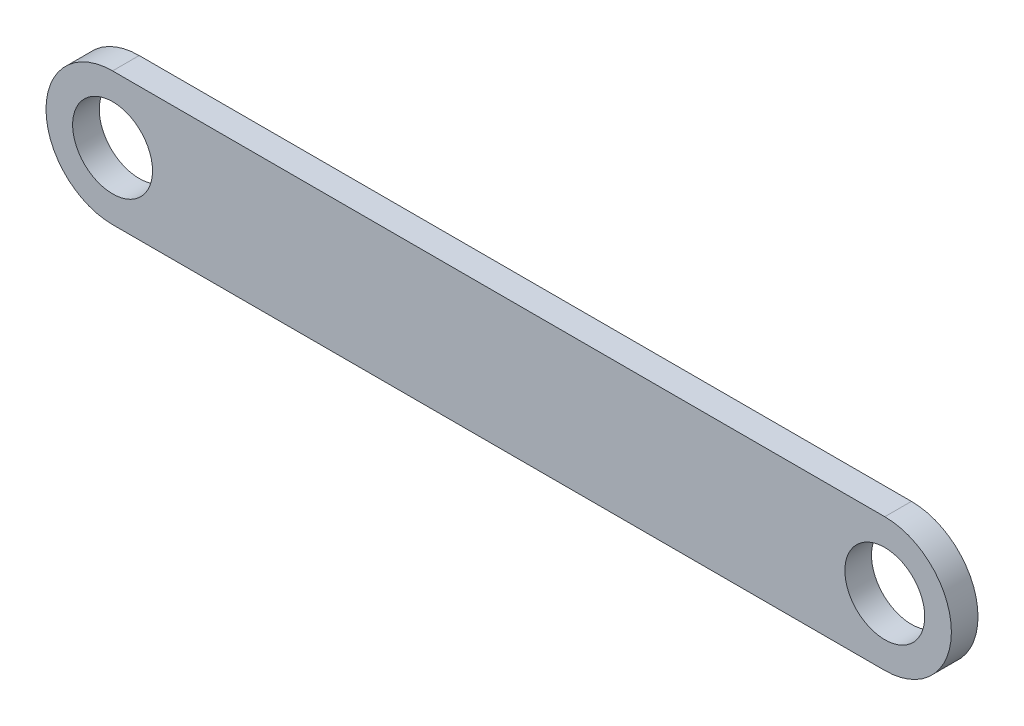
ISO-10303-21;
HEADER;
FILE_DESCRIPTION(('STEP AP214'),'2;1');
FILE_NAME('part.step','',(''),(''),'','','');
FILE_SCHEMA(('AUTOMOTIVE_DESIGN { 1 0 10303 214 1 1 1 1 }'));
ENDSEC;
DATA;
#1=APPLICATION_CONTEXT('core data for automotive mechanical design processes');
#2=APPLICATION_PROTOCOL_DEFINITION('international standard','automotive_design',2000,#1);
#3=PRODUCT_CONTEXT('',#1,'mechanical');
#4=PRODUCT('Part','Part','',(#3));
#5=PRODUCT_RELATED_PRODUCT_CATEGORY('part','',(#4));
#6=PRODUCT_DEFINITION_FORMATION('','',#4);
#7=PRODUCT_DEFINITION_CONTEXT('part definition',#1,'design');
#8=PRODUCT_DEFINITION('design','',#6,#7);
#9=PRODUCT_DEFINITION_SHAPE('','',#8);
#10=(LENGTH_UNIT() NAMED_UNIT(*) SI_UNIT(.MILLI.,.METRE.));
#11=(NAMED_UNIT(*) PLANE_ANGLE_UNIT() SI_UNIT($,.RADIAN.));
#12=(NAMED_UNIT(*) SI_UNIT($,.STERADIAN.) SOLID_ANGLE_UNIT());
#13=UNCERTAINTY_MEASURE_WITH_UNIT(LENGTH_MEASURE(1.E-05),#10,'distance_accuracy_value','');
#14=(GEOMETRIC_REPRESENTATION_CONTEXT(3) GLOBAL_UNCERTAINTY_ASSIGNED_CONTEXT((#13)) GLOBAL_UNIT_ASSIGNED_CONTEXT((#10,
#11,#12)) REPRESENTATION_CONTEXT('',''));
#15=CARTESIAN_POINT('',(0.,0.,0.));
#16=DIRECTION('',(0.,0.,1.));
#17=DIRECTION('',(1.,0.,0.));
#18=AXIS2_PLACEMENT_3D('',#15,#16,#17);
#19=CARTESIAN_POINT('',(0.,0.,2.5));
#20=DIRECTION('',(0.,0.,1.));
#21=DIRECTION('',(1.,0.,0.));
#22=AXIS2_PLACEMENT_3D('',#19,#20,#21);
#23=PLANE('',#22);
#24=CARTESIAN_POINT('',(0.,0.,2.5));
#25=DIRECTION('',(0.,0.,1.));
#26=DIRECTION('',(1.,0.,0.));
#27=AXIS2_PLACEMENT_3D('',#24,#25,#26);
#28=CIRCLE('',#27,7.5);
#29=CARTESIAN_POINT('',(7.5,0.,2.5));
#30=VERTEX_POINT('',#29);
#31=EDGE_CURVE('E102',#30,#30,#28,.T.);
#32=ORIENTED_EDGE('',*,*,#31,.F.);
#33=EDGE_LOOP('',(#32));
#34=FACE_BOUND('',#33,.T.);
#35=CARTESIAN_POINT('',(0.,0.,2.5));
#36=DIRECTION('',(0.,0.,1.));
#37=DIRECTION('',(1.,0.,0.));
#38=AXIS2_PLACEMENT_3D('',#35,#36,#37);
#39=CIRCLE('',#38,12.5);
#40=CARTESIAN_POINT('',(0.,12.5,2.5));
#41=VERTEX_POINT('',#40);
#42=CARTESIAN_POINT('',(0.,-12.5,2.5));
#43=VERTEX_POINT('',#42);
#44=EDGE_CURVE('E87',#41,#43,#39,.T.);
#45=ORIENTED_EDGE('',*,*,#44,.T.);
#46=DIRECTION('',(1.,0.,0.));
#47=VECTOR('',#46,1.);
#48=CARTESIAN_POINT('',(0.,-12.5,2.5));
#49=LINE('',#48,#47);
#50=CARTESIAN_POINT('',(145.,-12.5,2.5));
#51=VERTEX_POINT('',#50);
#52=EDGE_CURVE('E82',#43,#51,#49,.T.);
#53=ORIENTED_EDGE('',*,*,#52,.T.);
#54=CARTESIAN_POINT('',(145.,0.,2.5));
#55=DIRECTION('',(0.,0.,1.));
#56=DIRECTION('',(1.,0.,0.));
#57=AXIS2_PLACEMENT_3D('',#54,#55,#56);
#58=CIRCLE('',#57,12.5);
#59=CARTESIAN_POINT('',(145.,12.5,2.5));
#60=VERTEX_POINT('',#59);
#61=EDGE_CURVE('E85',#51,#60,#58,.T.);
#62=ORIENTED_EDGE('',*,*,#61,.T.);
#63=DIRECTION('',(-1.,0.,0.));
#64=VECTOR('',#63,1.);
#65=CARTESIAN_POINT('',(0.,12.5,2.5));
#66=LINE('',#65,#64);
#67=EDGE_CURVE('E52',#60,#41,#66,.T.);
#68=ORIENTED_EDGE('',*,*,#67,.T.);
#69=EDGE_LOOP('',(#45,#53,#62,#68));
#70=FACE_BOUND('',#69,.T.);
#71=CARTESIAN_POINT('',(145.,0.,2.5));
#72=DIRECTION('',(0.,0.,1.));
#73=DIRECTION('',(1.,0.,0.));
#74=AXIS2_PLACEMENT_3D('',#71,#72,#73);
#75=CIRCLE('',#74,7.50000000000001);
#76=CARTESIAN_POINT('',(152.5,0.,2.5));
#77=VERTEX_POINT('',#76);
#78=EDGE_CURVE('E117',#77,#77,#75,.T.);
#79=ORIENTED_EDGE('',*,*,#78,.F.);
#80=EDGE_LOOP('',(#79));
#81=FACE_BOUND('',#80,.T.);
#82=ADVANCED_FACE('F35',(#34,#70,#81),#23,.T.);
#83=CARTESIAN_POINT('',(0.,0.,-2.5));
#84=DIRECTION('',(0.,0.,1.));
#85=DIRECTION('',(1.,0.,0.));
#86=AXIS2_PLACEMENT_3D('',#83,#84,#85);
#87=PLANE('',#86);
#88=CARTESIAN_POINT('',(0.,0.,-2.5));
#89=DIRECTION('',(0.,0.,1.));
#90=DIRECTION('',(1.,0.,0.));
#91=AXIS2_PLACEMENT_3D('',#88,#89,#90);
#92=CIRCLE('',#91,12.5);
#93=CARTESIAN_POINT('',(0.,12.5,-2.5));
#94=VERTEX_POINT('',#93);
#95=CARTESIAN_POINT('',(0.,-12.5,-2.5));
#96=VERTEX_POINT('',#95);
#97=EDGE_CURVE('E99',#94,#96,#92,.T.);
#98=ORIENTED_EDGE('',*,*,#97,.F.);
#99=DIRECTION('',(-1.,0.,0.));
#100=VECTOR('',#99,1.);
#101=CARTESIAN_POINT('',(0.,12.5,-2.5));
#102=LINE('',#101,#100);
#103=CARTESIAN_POINT('',(145.,12.5,-2.5));
#104=VERTEX_POINT('',#103);
#105=EDGE_CURVE('E75',#104,#94,#102,.T.);
#106=ORIENTED_EDGE('',*,*,#105,.F.);
#107=CARTESIAN_POINT('',(145.,0.,-2.5));
#108=DIRECTION('',(0.,0.,1.));
#109=DIRECTION('',(1.,0.,0.));
#110=AXIS2_PLACEMENT_3D('',#107,#108,#109);
#111=CIRCLE('',#110,12.5);
#112=CARTESIAN_POINT('',(145.,-12.5,-2.5));
#113=VERTEX_POINT('',#112);
#114=EDGE_CURVE('E69',#113,#104,#111,.T.);
#115=ORIENTED_EDGE('',*,*,#114,.F.);
#116=DIRECTION('',(1.,0.,0.));
#117=VECTOR('',#116,1.);
#118=CARTESIAN_POINT('',(0.,-12.5,-2.5));
#119=LINE('',#118,#117);
#120=EDGE_CURVE('E91',#96,#113,#119,.T.);
#121=ORIENTED_EDGE('',*,*,#120,.F.);
#122=EDGE_LOOP('',(#98,#106,#115,#121));
#123=FACE_BOUND('',#122,.T.);
#124=CARTESIAN_POINT('',(0.,0.,-2.5));
#125=DIRECTION('',(0.,0.,1.));
#126=DIRECTION('',(1.,0.,0.));
#127=AXIS2_PLACEMENT_3D('',#124,#125,#126);
#128=CIRCLE('',#127,7.5);
#129=CARTESIAN_POINT('',(7.5,0.,-2.5));
#130=VERTEX_POINT('',#129);
#131=EDGE_CURVE('E114',#130,#130,#128,.T.);
#132=ORIENTED_EDGE('',*,*,#131,.T.);
#133=EDGE_LOOP('',(#132));
#134=FACE_BOUND('',#133,.T.);
#135=CARTESIAN_POINT('',(145.,0.,-2.5));
#136=DIRECTION('',(0.,0.,1.));
#137=DIRECTION('',(1.,0.,0.));
#138=AXIS2_PLACEMENT_3D('',#135,#136,#137);
#139=CIRCLE('',#138,7.50000000000001);
#140=CARTESIAN_POINT('',(152.5,0.,-2.5));
#141=VERTEX_POINT('',#140);
#142=EDGE_CURVE('E120',#141,#141,#139,.T.);
#143=ORIENTED_EDGE('',*,*,#142,.T.);
#144=EDGE_LOOP('',(#143));
#145=FACE_BOUND('',#144,.T.);
#146=ADVANCED_FACE('F110',(#123,#134,#145),#87,.F.);
#147=CARTESIAN_POINT('',(0.,0.,2.5));
#148=DIRECTION('',(0.,0.,-1.));
#149=DIRECTION('',(-1.,0.,0.));
#150=AXIS2_PLACEMENT_3D('',#147,#148,#149);
#151=CYLINDRICAL_SURFACE('',#150,12.5);
#152=ORIENTED_EDGE('',*,*,#97,.T.);
#153=DIRECTION('',(0.,0.,-1.));
#154=VECTOR('',#153,1.);
#155=CARTESIAN_POINT('',(0.,-12.5,2.5));
#156=LINE('',#155,#154);
#157=EDGE_CURVE('E11',#43,#96,#156,.T.);
#158=ORIENTED_EDGE('',*,*,#157,.F.);
#159=ORIENTED_EDGE('',*,*,#44,.F.);
#160=DIRECTION('',(0.,0.,-1.));
#161=VECTOR('',#160,1.);
#162=CARTESIAN_POINT('',(0.,12.5,2.5));
#163=LINE('',#162,#161);
#164=EDGE_CURVE('E95',#41,#94,#163,.T.);
#165=ORIENTED_EDGE('',*,*,#164,.T.);
#166=EDGE_LOOP('',(#152,#158,#159,#165));
#167=FACE_BOUND('',#166,.T.);
#168=ADVANCED_FACE('F37',(#167),#151,.T.);
#169=CARTESIAN_POINT('',(0.,-12.5,2.5));
#170=DIRECTION('',(0.,1.,0.));
#171=DIRECTION('',(-1.,0.,0.));
#172=AXIS2_PLACEMENT_3D('',#169,#170,#171);
#173=PLANE('',#172);
#174=ORIENTED_EDGE('',*,*,#120,.T.);
#175=DIRECTION('',(0.,0.,-1.));
#176=VECTOR('',#175,1.);
#177=CARTESIAN_POINT('',(145.,-12.5,2.5));
#178=LINE('',#177,#176);
#179=EDGE_CURVE('E44',#51,#113,#178,.T.);
#180=ORIENTED_EDGE('',*,*,#179,.F.);
#181=ORIENTED_EDGE('',*,*,#52,.F.);
#182=ORIENTED_EDGE('',*,*,#157,.T.);
#183=EDGE_LOOP('',(#174,#180,#181,#182));
#184=FACE_BOUND('',#183,.T.);
#185=ADVANCED_FACE('F90',(#184),#173,.F.);
#186=CARTESIAN_POINT('',(145.,0.,2.5));
#187=DIRECTION('',(0.,0.,-1.));
#188=DIRECTION('',(-1.,0.,0.));
#189=AXIS2_PLACEMENT_3D('',#186,#187,#188);
#190=CYLINDRICAL_SURFACE('',#189,12.5);
#191=ORIENTED_EDGE('',*,*,#114,.T.);
#192=DIRECTION('',(0.,0.,-1.));
#193=VECTOR('',#192,1.);
#194=CARTESIAN_POINT('',(145.,12.5,2.5));
#195=LINE('',#194,#193);
#196=EDGE_CURVE('E92',#60,#104,#195,.T.);
#197=ORIENTED_EDGE('',*,*,#196,.F.);
#198=ORIENTED_EDGE('',*,*,#61,.F.);
#199=ORIENTED_EDGE('',*,*,#179,.T.);
#200=EDGE_LOOP('',(#191,#197,#198,#199));
#201=FACE_BOUND('',#200,.T.);
#202=ADVANCED_FACE('F93',(#201),#190,.T.);
#203=CARTESIAN_POINT('',(0.,12.5,2.5));
#204=DIRECTION('',(0.,-1.,0.));
#205=DIRECTION('',(1.,0.,0.));
#206=AXIS2_PLACEMENT_3D('',#203,#204,#205);
#207=PLANE('',#206);
#208=ORIENTED_EDGE('',*,*,#105,.T.);
#209=ORIENTED_EDGE('',*,*,#164,.F.);
#210=ORIENTED_EDGE('',*,*,#67,.F.);
#211=ORIENTED_EDGE('',*,*,#196,.T.);
#212=EDGE_LOOP('',(#208,#209,#210,#211));
#213=FACE_BOUND('',#212,.T.);
#214=ADVANCED_FACE('F107',(#213),#207,.F.);
#215=CARTESIAN_POINT('',(0.,0.,2.5));
#216=DIRECTION('',(0.,0.,-1.));
#217=DIRECTION('',(-1.,0.,0.));
#218=AXIS2_PLACEMENT_3D('',#215,#216,#217);
#219=CYLINDRICAL_SURFACE('',#218,7.5);
#220=ORIENTED_EDGE('',*,*,#31,.T.);
#221=EDGE_LOOP('',(#220));
#222=FACE_BOUND('',#221,.T.);
#223=ORIENTED_EDGE('',*,*,#131,.F.);
#224=EDGE_LOOP('',(#223));
#225=FACE_BOUND('',#224,.T.);
#226=ADVANCED_FACE('F137',(#222,#225),#219,.F.);
#227=CARTESIAN_POINT('',(145.,0.,2.5));
#228=DIRECTION('',(0.,0.,-1.));
#229=DIRECTION('',(-1.,0.,0.));
#230=AXIS2_PLACEMENT_3D('',#227,#228,#229);
#231=CYLINDRICAL_SURFACE('',#230,7.50000000000001);
#232=ORIENTED_EDGE('',*,*,#78,.T.);
#233=EDGE_LOOP('',(#232));
#234=FACE_BOUND('',#233,.T.);
#235=ORIENTED_EDGE('',*,*,#142,.F.);
#236=EDGE_LOOP('',(#235));
#237=FACE_BOUND('',#236,.T.);
#238=ADVANCED_FACE('F126',(#234,#237),#231,.F.);
#239=CLOSED_SHELL('',(#82,#146,#168,#185,#202,#214,#226,#238));
#240=MANIFOLD_SOLID_BREP('B2',#239);
#241=ADVANCED_BREP_SHAPE_REPRESENTATION('',(#18,#240),#14);
#242=SHAPE_DEFINITION_REPRESENTATION(#9,#241);
ENDSEC;
END-ISO-10303-21;
